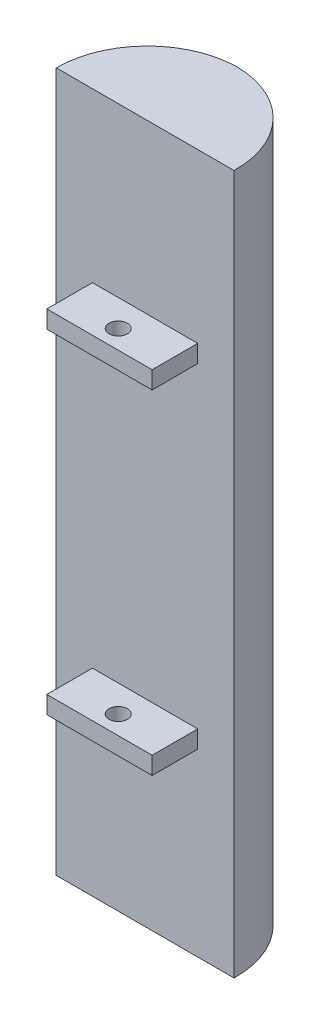
ISO-10303-21;
HEADER;
FILE_DESCRIPTION(('STEP AP214'),'2;1');
FILE_NAME('part.step','',(''),(''),'','','');
FILE_SCHEMA(('AUTOMOTIVE_DESIGN { 1 0 10303 214 1 1 1 1 }'));
ENDSEC;
DATA;
#1=APPLICATION_CONTEXT('core data for automotive mechanical design processes');
#2=APPLICATION_PROTOCOL_DEFINITION('international standard','automotive_design',2000,#1);
#3=PRODUCT_CONTEXT('',#1,'mechanical');
#4=PRODUCT('Part','Part','',(#3));
#5=PRODUCT_RELATED_PRODUCT_CATEGORY('part','',(#4));
#6=PRODUCT_DEFINITION_FORMATION('','',#4);
#7=PRODUCT_DEFINITION_CONTEXT('part definition',#1,'design');
#8=PRODUCT_DEFINITION('design','',#6,#7);
#9=PRODUCT_DEFINITION_SHAPE('','',#8);
#10=(LENGTH_UNIT() NAMED_UNIT(*) SI_UNIT(.MILLI.,.METRE.));
#11=(NAMED_UNIT(*) PLANE_ANGLE_UNIT() SI_UNIT($,.RADIAN.));
#12=(NAMED_UNIT(*) SI_UNIT($,.STERADIAN.) SOLID_ANGLE_UNIT());
#13=UNCERTAINTY_MEASURE_WITH_UNIT(LENGTH_MEASURE(1.E-05),#10,'distance_accuracy_value','');
#14=(GEOMETRIC_REPRESENTATION_CONTEXT(3) GLOBAL_UNCERTAINTY_ASSIGNED_CONTEXT((#13)) GLOBAL_UNIT_ASSIGNED_CONTEXT((#10,
#11,#12)) REPRESENTATION_CONTEXT('',''));
#15=CARTESIAN_POINT('',(0.,0.,0.));
#16=DIRECTION('',(0.,0.,1.));
#17=DIRECTION('',(1.,0.,0.));
#18=AXIS2_PLACEMENT_3D('',#15,#16,#17);
#19=CARTESIAN_POINT('',(-76.,598.,0.));
#20=DIRECTION('',(0.,0.,-1.));
#21=DIRECTION('',(-1.,0.,0.));
#22=AXIS2_PLACEMENT_3D('',#19,#20,#21);
#23=PLANE('',#22);
#24=DIRECTION('',(0.,1.,0.));
#25=VECTOR('',#24,1.);
#26=CARTESIAN_POINT('',(45.,439.440168310259,0.));
#27=LINE('',#26,#25);
#28=CARTESIAN_POINT('',(45.,439.440168310259,0.));
#29=VERTEX_POINT('',#28);
#30=CARTESIAN_POINT('',(45.,454.440168310259,0.));
#31=VERTEX_POINT('',#30);
#32=EDGE_CURVE('E138',#29,#31,#27,.T.);
#33=ORIENTED_EDGE('',*,*,#32,.F.);
#34=DIRECTION('',(1.,0.,0.));
#35=VECTOR('',#34,1.);
#36=CARTESIAN_POINT('',(-45.,439.440168310259,0.));
#37=LINE('',#36,#35);
#38=CARTESIAN_POINT('',(-45.,439.440168310259,0.));
#39=VERTEX_POINT('',#38);
#40=EDGE_CURVE('E151',#39,#29,#37,.T.);
#41=ORIENTED_EDGE('',*,*,#40,.F.);
#42=DIRECTION('',(0.,-1.,0.));
#43=VECTOR('',#42,1.);
#44=CARTESIAN_POINT('',(-45.,439.440168310259,0.));
#45=LINE('',#44,#43);
#46=CARTESIAN_POINT('',(-45.,454.440168310258,0.));
#47=VERTEX_POINT('',#46);
#48=EDGE_CURVE('E160',#47,#39,#45,.T.);
#49=ORIENTED_EDGE('',*,*,#48,.F.);
#50=DIRECTION('',(-1.,0.,0.));
#51=VECTOR('',#50,1.);
#52=CARTESIAN_POINT('',(-45.,454.440168310259,0.));
#53=LINE('',#52,#51);
#54=EDGE_CURVE('E141',#31,#47,#53,.T.);
#55=ORIENTED_EDGE('',*,*,#54,.F.);
#56=EDGE_LOOP('',(#33,#41,#49,#55));
#57=FACE_BOUND('',#56,.T.);
#58=DIRECTION('',(1.,0.,0.));
#59=VECTOR('',#58,1.);
#60=CARTESIAN_POINT('',(-76.,0.,0.));
#61=LINE('',#60,#59);
#62=CARTESIAN_POINT('',(-76.,0.,0.));
#63=VERTEX_POINT('',#62);
#64=CARTESIAN_POINT('',(76.,0.,0.));
#65=VERTEX_POINT('',#64);
#66=EDGE_CURVE('E181',#63,#65,#61,.T.);
#67=ORIENTED_EDGE('',*,*,#66,.T.);
#68=DIRECTION('',(0.,-1.,0.));
#69=VECTOR('',#68,1.);
#70=CARTESIAN_POINT('',(76.,598.,0.));
#71=LINE('',#70,#69);
#72=CARTESIAN_POINT('',(76.,598.,0.));
#73=VERTEX_POINT('',#72);
#74=EDGE_CURVE('E185',#73,#65,#71,.T.);
#75=ORIENTED_EDGE('',*,*,#74,.F.);
#76=DIRECTION('',(1.,0.,0.));
#77=VECTOR('',#76,1.);
#78=CARTESIAN_POINT('',(-76.,598.,0.));
#79=LINE('',#78,#77);
#80=CARTESIAN_POINT('',(-76.,598.,0.));
#81=VERTEX_POINT('',#80);
#82=EDGE_CURVE('E183',#81,#73,#79,.T.);
#83=ORIENTED_EDGE('',*,*,#82,.F.);
#84=DIRECTION('',(0.,-1.,0.));
#85=VECTOR('',#84,1.);
#86=CARTESIAN_POINT('',(-76.,598.,0.));
#87=LINE('',#86,#85);
#88=EDGE_CURVE('E42',#81,#63,#87,.T.);
#89=ORIENTED_EDGE('',*,*,#88,.T.);
#90=EDGE_LOOP('',(#67,#75,#83,#89));
#91=FACE_BOUND('',#90,.T.);
#92=DIRECTION('',(0.,1.,0.));
#93=VECTOR('',#92,1.);
#94=CARTESIAN_POINT('',(45.,153.960515061216,0.));
#95=LINE('',#94,#93);
#96=CARTESIAN_POINT('',(45.,153.960515061216,0.));
#97=VERTEX_POINT('',#96);
#98=CARTESIAN_POINT('',(45.,168.960515061217,0.));
#99=VERTEX_POINT('',#98);
#100=EDGE_CURVE('E137',#97,#99,#95,.T.);
#101=ORIENTED_EDGE('',*,*,#100,.F.);
#102=DIRECTION('',(1.,0.,0.));
#103=VECTOR('',#102,1.);
#104=CARTESIAN_POINT('',(-45.,153.960515061216,0.));
#105=LINE('',#104,#103);
#106=CARTESIAN_POINT('',(-45.,153.960515061216,0.));
#107=VERTEX_POINT('',#106);
#108=EDGE_CURVE('E134',#107,#97,#105,.T.);
#109=ORIENTED_EDGE('',*,*,#108,.F.);
#110=DIRECTION('',(0.,-1.,0.));
#111=VECTOR('',#110,1.);
#112=CARTESIAN_POINT('',(-45.,153.960515061216,0.));
#113=LINE('',#112,#111);
#114=CARTESIAN_POINT('',(-45.,168.960515061217,0.));
#115=VERTEX_POINT('',#114);
#116=EDGE_CURVE('E54',#115,#107,#113,.T.);
#117=ORIENTED_EDGE('',*,*,#116,.F.);
#118=DIRECTION('',(-1.,0.,0.));
#119=VECTOR('',#118,1.);
#120=CARTESIAN_POINT('',(-45.,168.960515061217,0.));
#121=LINE('',#120,#119);
#122=EDGE_CURVE('E49',#99,#115,#121,.T.);
#123=ORIENTED_EDGE('',*,*,#122,.F.);
#124=EDGE_LOOP('',(#101,#109,#117,#123));
#125=FACE_BOUND('',#124,.T.);
#126=ADVANCED_FACE('F33',(#57,#91,#125),#23,.F.);
#127=CARTESIAN_POINT('',(0.,598.,-1.97435897435896));
#128=DIRECTION('',(0.,-1.,0.));
#129=DIRECTION('',(0.,0.,-1.));
#130=AXIS2_PLACEMENT_3D('',#127,#128,#129);
#131=CYLINDRICAL_SURFACE('',#130,76.025641025641);
#132=CARTESIAN_POINT('',(0.,0.,-1.97435897435896));
#133=DIRECTION('',(0.,1.,0.));
#134=DIRECTION('',(0.,0.,-1.));
#135=AXIS2_PLACEMENT_3D('',#132,#133,#134);
#136=CIRCLE('',#135,76.025641025641);
#137=CARTESIAN_POINT('',(0.,0.,-78.));
#138=VERTEX_POINT('',#137);
#139=EDGE_CURVE('E176',#65,#138,#136,.T.);
#140=ORIENTED_EDGE('',*,*,#139,.T.);
#141=DIRECTION('',(0.,-1.,0.));
#142=VECTOR('',#141,1.);
#143=CARTESIAN_POINT('',(0.,598.,-78.));
#144=LINE('',#143,#142);
#145=CARTESIAN_POINT('',(0.,598.,-78.));
#146=VERTEX_POINT('',#145);
#147=EDGE_CURVE('E11',#146,#138,#144,.T.);
#148=ORIENTED_EDGE('',*,*,#147,.F.);
#149=CARTESIAN_POINT('',(0.,598.,-1.97435897435896));
#150=DIRECTION('',(0.,1.,0.));
#151=DIRECTION('',(0.,0.,-1.));
#152=AXIS2_PLACEMENT_3D('',#149,#150,#151);
#153=CIRCLE('',#152,76.025641025641);
#154=EDGE_CURVE('E177',#73,#146,#153,.T.);
#155=ORIENTED_EDGE('',*,*,#154,.F.);
#156=ORIENTED_EDGE('',*,*,#74,.T.);
#157=EDGE_LOOP('',(#140,#148,#155,#156));
#158=FACE_BOUND('',#157,.T.);
#159=ADVANCED_FACE('F35',(#158),#131,.T.);
#160=CARTESIAN_POINT('',(2.02631578947371,598.,0.));
#161=DIRECTION('',(0.,-1.,0.));
#162=DIRECTION('',(0.,0.,-1.));
#163=AXIS2_PLACEMENT_3D('',#160,#161,#162);
#164=CYLINDRICAL_SURFACE('',#163,78.0263157894737);
#165=CARTESIAN_POINT('',(2.02631578947371,0.,0.));
#166=DIRECTION('',(0.,1.,0.));
#167=DIRECTION('',(0.,0.,-1.));
#168=AXIS2_PLACEMENT_3D('',#165,#166,#167);
#169=CIRCLE('',#168,78.0263157894737);
#170=EDGE_CURVE('E188',#138,#63,#169,.T.);
#171=ORIENTED_EDGE('',*,*,#170,.T.);
#172=ORIENTED_EDGE('',*,*,#88,.F.);
#173=CARTESIAN_POINT('',(2.02631578947371,598.,0.));
#174=DIRECTION('',(0.,1.,0.));
#175=DIRECTION('',(0.,0.,-1.));
#176=AXIS2_PLACEMENT_3D('',#173,#174,#175);
#177=CIRCLE('',#176,78.0263157894737);
#178=EDGE_CURVE('E180',#146,#81,#177,.T.);
#179=ORIENTED_EDGE('',*,*,#178,.F.);
#180=ORIENTED_EDGE('',*,*,#147,.T.);
#181=EDGE_LOOP('',(#171,#172,#179,#180));
#182=FACE_BOUND('',#181,.T.);
#183=ADVANCED_FACE('F208',(#182),#164,.T.);
#184=CARTESIAN_POINT('',(0.,598.,-1.97435897435896));
#185=DIRECTION('',(0.,-1.,0.));
#186=DIRECTION('',(0.,0.,-1.));
#187=AXIS2_PLACEMENT_3D('',#184,#185,#186);
#188=PLANE('',#187);
#189=ORIENTED_EDGE('',*,*,#154,.T.);
#190=ORIENTED_EDGE('',*,*,#178,.T.);
#191=ORIENTED_EDGE('',*,*,#82,.T.);
#192=EDGE_LOOP('',(#189,#190,#191));
#193=FACE_BOUND('',#192,.T.);
#194=ADVANCED_FACE('F207',(#193),#188,.F.);
#195=CARTESIAN_POINT('',(0.,0.,-1.97435897435896));
#196=DIRECTION('',(0.,-1.,0.));
#197=DIRECTION('',(0.,0.,-1.));
#198=AXIS2_PLACEMENT_3D('',#195,#196,#197);
#199=PLANE('',#198);
#200=ORIENTED_EDGE('',*,*,#139,.F.);
#201=ORIENTED_EDGE('',*,*,#66,.F.);
#202=ORIENTED_EDGE('',*,*,#170,.F.);
#203=EDGE_LOOP('',(#200,#201,#202));
#204=FACE_BOUND('',#203,.T.);
#205=ADVANCED_FACE('F202',(#204),#199,.T.);
#206=CARTESIAN_POINT('',(45.,439.440168310259,39.));
#207=DIRECTION('',(-1.,0.,0.));
#208=DIRECTION('',(0.,0.,1.));
#209=AXIS2_PLACEMENT_3D('',#206,#207,#208);
#210=PLANE('',#209);
#211=ORIENTED_EDGE('',*,*,#32,.T.);
#212=DIRECTION('',(0.,0.,-1.));
#213=VECTOR('',#212,1.);
#214=CARTESIAN_POINT('',(45.,454.440168310259,39.));
#215=LINE('',#214,#213);
#216=CARTESIAN_POINT('',(45.,454.440168310259,39.));
#217=VERTEX_POINT('',#216);
#218=EDGE_CURVE('E173',#217,#31,#215,.T.);
#219=ORIENTED_EDGE('',*,*,#218,.F.);
#220=DIRECTION('',(0.,1.,0.));
#221=VECTOR('',#220,1.);
#222=CARTESIAN_POINT('',(45.,439.440168310259,39.));
#223=LINE('',#222,#221);
#224=CARTESIAN_POINT('',(45.,439.440168310259,39.));
#225=VERTEX_POINT('',#224);
#226=EDGE_CURVE('E147',#225,#217,#223,.T.);
#227=ORIENTED_EDGE('',*,*,#226,.F.);
#228=DIRECTION('',(0.,0.,-1.));
#229=VECTOR('',#228,1.);
#230=CARTESIAN_POINT('',(45.,439.440168310259,39.));
#231=LINE('',#230,#229);
#232=EDGE_CURVE('E156',#225,#29,#231,.T.);
#233=ORIENTED_EDGE('',*,*,#232,.T.);
#234=EDGE_LOOP('',(#211,#219,#227,#233));
#235=FACE_BOUND('',#234,.T.);
#236=ADVANCED_FACE('F224',(#235),#210,.F.);
#237=CARTESIAN_POINT('',(-45.,454.440168310259,39.));
#238=DIRECTION('',(0.,-1.,0.));
#239=DIRECTION('',(0.,0.,-1.));
#240=AXIS2_PLACEMENT_3D('',#237,#238,#239);
#241=PLANE('',#240);
#242=CARTESIAN_POINT('',(0.,454.440168310259,22.9839423769189));
#243=DIRECTION('',(0.,-1.,0.));
#244=DIRECTION('',(0.,0.,-1.));
#245=AXIS2_PLACEMENT_3D('',#242,#243,#244);
#246=CIRCLE('',#245,7.875);
#247=CARTESIAN_POINT('',(0.,454.440168310259,15.108942376919));
#248=VERTEX_POINT('',#247);
#249=EDGE_CURVE('E274',#248,#248,#246,.T.);
#250=ORIENTED_EDGE('',*,*,#249,.T.);
#251=EDGE_LOOP('',(#250));
#252=FACE_BOUND('',#251,.T.);
#253=ORIENTED_EDGE('',*,*,#54,.T.);
#254=DIRECTION('',(0.,0.,-1.));
#255=VECTOR('',#254,1.);
#256=CARTESIAN_POINT('',(-45.,454.440168310259,39.));
#257=LINE('',#256,#255);
#258=CARTESIAN_POINT('',(-45.,454.440168310259,39.));
#259=VERTEX_POINT('',#258);
#260=EDGE_CURVE('E170',#259,#47,#257,.T.);
#261=ORIENTED_EDGE('',*,*,#260,.F.);
#262=DIRECTION('',(-1.,0.,0.));
#263=VECTOR('',#262,1.);
#264=CARTESIAN_POINT('',(-45.,454.440168310259,39.));
#265=LINE('',#264,#263);
#266=EDGE_CURVE('E150',#217,#259,#265,.T.);
#267=ORIENTED_EDGE('',*,*,#266,.F.);
#268=ORIENTED_EDGE('',*,*,#218,.T.);
#269=EDGE_LOOP('',(#253,#261,#267,#268));
#270=FACE_BOUND('',#269,.T.);
#271=ADVANCED_FACE('F228',(#252,#270),#241,.F.);
#272=CARTESIAN_POINT('',(-45.,439.440168310259,39.));
#273=DIRECTION('',(1.,0.,0.));
#274=DIRECTION('',(0.,0.,-1.));
#275=AXIS2_PLACEMENT_3D('',#272,#273,#274);
#276=PLANE('',#275);
#277=ORIENTED_EDGE('',*,*,#48,.T.);
#278=DIRECTION('',(0.,0.,-1.));
#279=VECTOR('',#278,1.);
#280=CARTESIAN_POINT('',(-45.,439.440168310259,39.));
#281=LINE('',#280,#279);
#282=CARTESIAN_POINT('',(-45.,439.440168310259,39.));
#283=VERTEX_POINT('',#282);
#284=EDGE_CURVE('E167',#283,#39,#281,.T.);
#285=ORIENTED_EDGE('',*,*,#284,.F.);
#286=DIRECTION('',(0.,-1.,0.));
#287=VECTOR('',#286,1.);
#288=CARTESIAN_POINT('',(-45.,439.440168310259,39.));
#289=LINE('',#288,#287);
#290=EDGE_CURVE('E153',#259,#283,#289,.T.);
#291=ORIENTED_EDGE('',*,*,#290,.F.);
#292=ORIENTED_EDGE('',*,*,#260,.T.);
#293=EDGE_LOOP('',(#277,#285,#291,#292));
#294=FACE_BOUND('',#293,.T.);
#295=ADVANCED_FACE('F232',(#294),#276,.F.);
#296=CARTESIAN_POINT('',(-45.,439.440168310259,39.));
#297=DIRECTION('',(0.,1.,0.));
#298=DIRECTION('',(0.,0.,1.));
#299=AXIS2_PLACEMENT_3D('',#296,#297,#298);
#300=PLANE('',#299);
#301=CARTESIAN_POINT('',(0.,439.440168310259,22.9839423769189));
#302=DIRECTION('',(0.,1.,0.));
#303=DIRECTION('',(0.,0.,1.));
#304=AXIS2_PLACEMENT_3D('',#301,#302,#303);
#305=CIRCLE('',#304,7.875);
#306=CARTESIAN_POINT('',(0.,439.440168310258,15.108942376919));
#307=VERTEX_POINT('',#306);
#308=EDGE_CURVE('E271',#307,#307,#305,.T.);
#309=ORIENTED_EDGE('',*,*,#308,.T.);
#310=EDGE_LOOP('',(#309));
#311=FACE_BOUND('',#310,.T.);
#312=ORIENTED_EDGE('',*,*,#40,.T.);
#313=ORIENTED_EDGE('',*,*,#232,.F.);
#314=DIRECTION('',(1.,0.,0.));
#315=VECTOR('',#314,1.);
#316=CARTESIAN_POINT('',(-45.,439.440168310259,39.));
#317=LINE('',#316,#315);
#318=EDGE_CURVE('E155',#283,#225,#317,.T.);
#319=ORIENTED_EDGE('',*,*,#318,.F.);
#320=ORIENTED_EDGE('',*,*,#284,.T.);
#321=EDGE_LOOP('',(#312,#313,#319,#320));
#322=FACE_BOUND('',#321,.T.);
#323=ADVANCED_FACE('F236',(#311,#322),#300,.F.);
#324=CARTESIAN_POINT('',(0.,0.,39.));
#325=DIRECTION('',(0.,0.,-1.));
#326=DIRECTION('',(-1.,0.,0.));
#327=AXIS2_PLACEMENT_3D('',#324,#325,#326);
#328=PLANE('',#327);
#329=ORIENTED_EDGE('',*,*,#226,.T.);
#330=ORIENTED_EDGE('',*,*,#266,.T.);
#331=ORIENTED_EDGE('',*,*,#290,.T.);
#332=ORIENTED_EDGE('',*,*,#318,.T.);
#333=EDGE_LOOP('',(#329,#330,#331,#332));
#334=FACE_BOUND('',#333,.T.);
#335=ADVANCED_FACE('F240',(#334),#328,.F.);
#336=CARTESIAN_POINT('',(45.,153.960515061216,39.));
#337=DIRECTION('',(-1.,0.,0.));
#338=DIRECTION('',(0.,0.,1.));
#339=AXIS2_PLACEMENT_3D('',#336,#337,#338);
#340=PLANE('',#339);
#341=ORIENTED_EDGE('',*,*,#100,.T.);
#342=DIRECTION('',(0.,0.,-1.));
#343=VECTOR('',#342,1.);
#344=CARTESIAN_POINT('',(45.,168.960515061217,39.));
#345=LINE('',#344,#343);
#346=CARTESIAN_POINT('',(45.,168.960515061217,39.));
#347=VERTEX_POINT('',#346);
#348=EDGE_CURVE('E118',#347,#99,#345,.T.);
#349=ORIENTED_EDGE('',*,*,#348,.F.);
#350=DIRECTION('',(0.,1.,0.));
#351=VECTOR('',#350,1.);
#352=CARTESIAN_POINT('',(45.,153.960515061216,39.));
#353=LINE('',#352,#351);
#354=CARTESIAN_POINT('',(45.,153.960515061216,39.));
#355=VERTEX_POINT('',#354);
#356=EDGE_CURVE('E125',#355,#347,#353,.T.);
#357=ORIENTED_EDGE('',*,*,#356,.F.);
#358=DIRECTION('',(0.,0.,-1.));
#359=VECTOR('',#358,1.);
#360=CARTESIAN_POINT('',(45.,153.960515061216,39.));
#361=LINE('',#360,#359);
#362=EDGE_CURVE('E282',#355,#97,#361,.T.);
#363=ORIENTED_EDGE('',*,*,#362,.T.);
#364=EDGE_LOOP('',(#341,#349,#357,#363));
#365=FACE_BOUND('',#364,.T.);
#366=ADVANCED_FACE('F136',(#365),#340,.F.);
#367=CARTESIAN_POINT('',(-45.,168.960515061217,39.));
#368=DIRECTION('',(0.,-1.,0.));
#369=DIRECTION('',(0.,0.,-1.));
#370=AXIS2_PLACEMENT_3D('',#367,#368,#369);
#371=PLANE('',#370);
#372=CARTESIAN_POINT('',(0.,168.960515061217,22.9839423769189));
#373=DIRECTION('',(0.,-1.,0.));
#374=DIRECTION('',(0.,0.,-1.));
#375=AXIS2_PLACEMENT_3D('',#372,#373,#374);
#376=CIRCLE('',#375,7.875);
#377=CARTESIAN_POINT('',(0.,168.960515061217,15.108942376919));
#378=VERTEX_POINT('',#377);
#379=EDGE_CURVE('E277',#378,#378,#376,.T.);
#380=ORIENTED_EDGE('',*,*,#379,.T.);
#381=EDGE_LOOP('',(#380));
#382=FACE_BOUND('',#381,.T.);
#383=ORIENTED_EDGE('',*,*,#122,.T.);
#384=DIRECTION('',(0.,0.,-1.));
#385=VECTOR('',#384,1.);
#386=CARTESIAN_POINT('',(-45.,168.960515061217,39.));
#387=LINE('',#386,#385);
#388=CARTESIAN_POINT('',(-45.,168.960515061217,39.));
#389=VERTEX_POINT('',#388);
#390=EDGE_CURVE('E121',#389,#115,#387,.T.);
#391=ORIENTED_EDGE('',*,*,#390,.F.);
#392=DIRECTION('',(-1.,0.,0.));
#393=VECTOR('',#392,1.);
#394=CARTESIAN_POINT('',(-45.,168.960515061217,39.));
#395=LINE('',#394,#393);
#396=EDGE_CURVE('E114',#347,#389,#395,.T.);
#397=ORIENTED_EDGE('',*,*,#396,.F.);
#398=ORIENTED_EDGE('',*,*,#348,.T.);
#399=EDGE_LOOP('',(#383,#391,#397,#398));
#400=FACE_BOUND('',#399,.T.);
#401=ADVANCED_FACE('F116',(#382,#400),#371,.F.);
#402=CARTESIAN_POINT('',(-45.,153.960515061216,39.));
#403=DIRECTION('',(1.,0.,0.));
#404=DIRECTION('',(0.,0.,-1.));
#405=AXIS2_PLACEMENT_3D('',#402,#403,#404);
#406=PLANE('',#405);
#407=ORIENTED_EDGE('',*,*,#116,.T.);
#408=DIRECTION('',(0.,0.,-1.));
#409=VECTOR('',#408,1.);
#410=CARTESIAN_POINT('',(-45.,153.960515061216,39.));
#411=LINE('',#410,#409);
#412=CARTESIAN_POINT('',(-45.,153.960515061216,39.));
#413=VERTEX_POINT('',#412);
#414=EDGE_CURVE('E143',#413,#107,#411,.T.);
#415=ORIENTED_EDGE('',*,*,#414,.F.);
#416=DIRECTION('',(0.,-1.,0.));
#417=VECTOR('',#416,1.);
#418=CARTESIAN_POINT('',(-45.,153.960515061216,39.));
#419=LINE('',#418,#417);
#420=EDGE_CURVE('E124',#389,#413,#419,.T.);
#421=ORIENTED_EDGE('',*,*,#420,.F.);
#422=ORIENTED_EDGE('',*,*,#390,.T.);
#423=EDGE_LOOP('',(#407,#415,#421,#422));
#424=FACE_BOUND('',#423,.T.);
#425=ADVANCED_FACE('F249',(#424),#406,.F.);
#426=CARTESIAN_POINT('',(-45.,153.960515061216,39.));
#427=DIRECTION('',(0.,1.,0.));
#428=DIRECTION('',(0.,0.,1.));
#429=AXIS2_PLACEMENT_3D('',#426,#427,#428);
#430=PLANE('',#429);
#431=CARTESIAN_POINT('',(0.,153.960515061216,22.9839423769189));
#432=DIRECTION('',(0.,1.,0.));
#433=DIRECTION('',(0.,0.,1.));
#434=AXIS2_PLACEMENT_3D('',#431,#432,#433);
#435=CIRCLE('',#434,7.875);
#436=CARTESIAN_POINT('',(0.,153.960515061216,15.108942376919));
#437=VERTEX_POINT('',#436);
#438=EDGE_CURVE('E37',#437,#437,#435,.T.);
#439=ORIENTED_EDGE('',*,*,#438,.T.);
#440=EDGE_LOOP('',(#439));
#441=FACE_BOUND('',#440,.T.);
#442=ORIENTED_EDGE('',*,*,#108,.T.);
#443=ORIENTED_EDGE('',*,*,#362,.F.);
#444=DIRECTION('',(1.,0.,0.));
#445=VECTOR('',#444,1.);
#446=CARTESIAN_POINT('',(-45.,153.960515061216,39.));
#447=LINE('',#446,#445);
#448=EDGE_CURVE('E130',#413,#355,#447,.T.);
#449=ORIENTED_EDGE('',*,*,#448,.F.);
#450=ORIENTED_EDGE('',*,*,#414,.T.);
#451=EDGE_LOOP('',(#442,#443,#449,#450));
#452=FACE_BOUND('',#451,.T.);
#453=ADVANCED_FACE('F253',(#441,#452),#430,.F.);
#454=CARTESIAN_POINT('',(0.,0.,39.));
#455=DIRECTION('',(0.,0.,-1.));
#456=DIRECTION('',(-1.,0.,0.));
#457=AXIS2_PLACEMENT_3D('',#454,#455,#456);
#458=PLANE('',#457);
#459=ORIENTED_EDGE('',*,*,#356,.T.);
#460=ORIENTED_EDGE('',*,*,#396,.T.);
#461=ORIENTED_EDGE('',*,*,#420,.T.);
#462=ORIENTED_EDGE('',*,*,#448,.T.);
#463=EDGE_LOOP('',(#459,#460,#461,#462));
#464=FACE_BOUND('',#463,.T.);
#465=ADVANCED_FACE('F128',(#464),#458,.F.);
#466=CARTESIAN_POINT('',(0.,598.,22.9839423769189));
#467=DIRECTION('',(0.,-1.,0.));
#468=DIRECTION('',(0.,0.,-1.));
#469=AXIS2_PLACEMENT_3D('',#466,#467,#468);
#470=CYLINDRICAL_SURFACE('',#469,7.875);
#471=CARTESIAN_POINT('',(0.,153.960515061216,15.108942376919));
#472=CARTESIAN_POINT('',(0.,154.116765061216,15.108942376919));
#473=CARTESIAN_POINT('',(0.,154.273015061217,15.108942376919));
#474=CARTESIAN_POINT('',(0.,154.585515061217,15.108942376919));
#475=CARTESIAN_POINT('',(0.,154.741765061216,15.108942376919));
#476=CARTESIAN_POINT('',(0.,155.054265061216,15.108942376919));
#477=CARTESIAN_POINT('',(0.,155.210515061216,15.108942376919));
#478=CARTESIAN_POINT('',(0.,155.523015061216,15.108942376919));
#479=CARTESIAN_POINT('',(0.,155.679265061217,15.108942376919));
#480=CARTESIAN_POINT('',(0.,155.991765061217,15.108942376919));
#481=CARTESIAN_POINT('',(0.,156.148015061216,15.108942376919));
#482=CARTESIAN_POINT('',(0.,156.460515061216,15.108942376919));
#483=CARTESIAN_POINT('',(0.,156.616765061216,15.108942376919));
#484=CARTESIAN_POINT('',(0.,156.929265061216,15.108942376919));
#485=CARTESIAN_POINT('',(0.,157.085515061217,15.108942376919));
#486=CARTESIAN_POINT('',(0.,157.398015061217,15.108942376919));
#487=CARTESIAN_POINT('',(0.,157.554265061217,15.108942376919));
#488=CARTESIAN_POINT('',(0.,157.866765061217,15.108942376919));
#489=CARTESIAN_POINT('',(0.,158.023015061216,15.108942376919));
#490=CARTESIAN_POINT('',(0.,158.335515061216,15.108942376919));
#491=CARTESIAN_POINT('',(0.,158.491765061217,15.108942376919));
#492=CARTESIAN_POINT('',(0.,158.804265061217,15.108942376919));
#493=CARTESIAN_POINT('',(0.,158.960515061217,15.108942376919));
#494=CARTESIAN_POINT('',(0.,159.273015061217,15.108942376919));
#495=CARTESIAN_POINT('',(0.,159.429265061216,15.108942376919));
#496=CARTESIAN_POINT('',(0.,159.741765061216,15.108942376919));
#497=CARTESIAN_POINT('',(0.,159.898015061217,15.108942376919));
#498=CARTESIAN_POINT('',(0.,160.210515061217,15.108942376919));
#499=CARTESIAN_POINT('',(0.,160.366765061217,15.108942376919));
#500=CARTESIAN_POINT('',(0.,160.679265061217,15.108942376919));
#501=CARTESIAN_POINT('',(0.,160.835515061216,15.108942376919));
#502=CARTESIAN_POINT('',(0.,161.148015061216,15.108942376919));
#503=CARTESIAN_POINT('',(0.,161.304265061217,15.108942376919));
#504=CARTESIAN_POINT('',(0.,161.616765061217,15.108942376919));
#505=CARTESIAN_POINT('',(0.,161.773015061217,15.108942376919));
#506=CARTESIAN_POINT('',(0.,162.085515061217,15.108942376919));
#507=CARTESIAN_POINT('',(0.,162.241765061216,15.108942376919));
#508=CARTESIAN_POINT('',(0.,162.554265061216,15.108942376919));
#509=CARTESIAN_POINT('',(0.,162.710515061217,15.108942376919));
#510=CARTESIAN_POINT('',(0.,163.023015061216,15.108942376919));
#511=CARTESIAN_POINT('',(0.,163.179265061217,15.108942376919));
#512=CARTESIAN_POINT('',(0.,163.491765061217,15.108942376919));
#513=CARTESIAN_POINT('',(0.,163.648015061216,15.108942376919));
#514=CARTESIAN_POINT('',(0.,163.960515061216,15.108942376919));
#515=CARTESIAN_POINT('',(0.,164.116765061217,15.108942376919));
#516=CARTESIAN_POINT('',(0.,164.429265061216,15.108942376919));
#517=CARTESIAN_POINT('',(0.,164.585515061217,15.108942376919));
#518=CARTESIAN_POINT('',(0.,164.898015061217,15.108942376919));
#519=CARTESIAN_POINT('',(0.,165.054265061216,15.108942376919));
#520=CARTESIAN_POINT('',(0.,165.366765061216,15.108942376919));
#521=CARTESIAN_POINT('',(0.,165.523015061217,15.108942376919));
#522=CARTESIAN_POINT('',(0.,165.835515061216,15.108942376919));
#523=CARTESIAN_POINT('',(0.,165.991765061217,15.108942376919));
#524=CARTESIAN_POINT('',(0.,166.304265061217,15.108942376919));
#525=CARTESIAN_POINT('',(0.,166.460515061217,15.108942376919));
#526=CARTESIAN_POINT('',(0.,166.773015061217,15.108942376919));
#527=CARTESIAN_POINT('',(0.,166.929265061216,15.108942376919));
#528=CARTESIAN_POINT('',(0.,167.241765061216,15.108942376919));
#529=CARTESIAN_POINT('',(0.,167.398015061217,15.108942376919));
#530=CARTESIAN_POINT('',(0.,167.710515061217,15.108942376919));
#531=CARTESIAN_POINT('',(0.,167.866765061217,15.108942376919));
#532=CARTESIAN_POINT('',(0.,168.179265061217,15.108942376919));
#533=CARTESIAN_POINT('',(0.,168.335515061216,15.108942376919));
#534=CARTESIAN_POINT('',(0.,168.648015061216,15.108942376919));
#535=CARTESIAN_POINT('',(0.,168.804265061217,15.108942376919));
#536=CARTESIAN_POINT('',(0.,168.960515061217,15.108942376919));
#537=B_SPLINE_CURVE_WITH_KNOTS('',3,(#471,#472,#473,#474,#475,#476,#477,#478,#479,#480,#481,
#482,#483,#484,#485,#486,#487,#488,#489,#490,#491,#492,#493,#494,#495,#496,#497,#498,#499,#500,
#501,#502,#503,#504,#505,#506,#507,#508,#509,#510,#511,#512,#513,#514,#515,#516,#517,#518,#519,
#520,#521,#522,#523,#524,#525,#526,#527,#528,#529,#530,#531,#532,#533,#534,#535,#536),
.UNSPECIFIED.,.F.,.F.,(4,2,2,2,2,2,2,2,2,2,2,2,2,2,2,2,2,2,2,2,2,2,2,2,2,2,2,2,2,2,2,2,4),(0.,
0.468750000000018,0.93749999999998,1.40625,1.87500000000002,2.34374999999998,2.8125,
3.28125000000001,3.75000000000003,4.21874999999999,4.68750000000001,5.15625000000003,
5.62499999999999,6.09375000000001,6.56250000000003,7.03124999999999,7.50000000000001,
7.96875000000002,8.43749999999999,8.90625,9.37500000000002,9.84374999999998,10.3125,10.78125,
11.25,11.71875,12.1875,12.65625,13.125,13.59375,14.0625,14.53125,15.),.UNSPECIFIED.);
#538=EDGE_CURVE('BSEAM260',#437,#378,#537,.T.);
#539=ORIENTED_EDGE('',*,*,#438,.F.);
#540=ORIENTED_EDGE('',*,*,#379,.F.);
#541=ORIENTED_EDGE('',*,*,#538,.T.);
#542=ORIENTED_EDGE('',*,*,#538,.F.);
#543=EDGE_LOOP('',(#539,#541,#540,#542));
#544=FACE_BOUND('',#543,.T.);
#545=ADVANCED_FACE('F260',(#544),#470,.F.);
#546=CARTESIAN_POINT('',(0.,439.440168310258,15.108942376919));
#547=CARTESIAN_POINT('',(0.,439.596418310258,15.108942376919));
#548=CARTESIAN_POINT('',(0.,439.752668310258,15.108942376919));
#549=CARTESIAN_POINT('',(0.,440.065168310259,15.108942376919));
#550=CARTESIAN_POINT('',(0.,440.221418310258,15.108942376919));
#551=CARTESIAN_POINT('',(0.,440.533918310259,15.108942376919));
#552=CARTESIAN_POINT('',(0.,440.690168310258,15.108942376919));
#553=CARTESIAN_POINT('',(0.,441.002668310259,15.108942376919));
#554=CARTESIAN_POINT('',(0.,441.158918310259,15.108942376919));
#555=CARTESIAN_POINT('',(0.,441.471418310259,15.108942376919));
#556=CARTESIAN_POINT('',(0.,441.627668310259,15.108942376919));
#557=CARTESIAN_POINT('',(0.,441.940168310259,15.108942376919));
#558=CARTESIAN_POINT('',(0.,442.096418310258,15.108942376919));
#559=CARTESIAN_POINT('',(0.,442.408918310258,15.108942376919));
#560=CARTESIAN_POINT('',(0.,442.565168310259,15.108942376919));
#561=CARTESIAN_POINT('',(0.,442.877668310259,15.108942376919));
#562=CARTESIAN_POINT('',(0.,443.033918310258,15.108942376919));
#563=CARTESIAN_POINT('',(0.,443.346418310259,15.108942376919));
#564=CARTESIAN_POINT('',(0.,443.502668310258,15.108942376919));
#565=CARTESIAN_POINT('',(0.,443.815168310259,15.108942376919));
#566=CARTESIAN_POINT('',(0.,443.971418310259,15.108942376919));
#567=CARTESIAN_POINT('',(0.,444.283918310259,15.108942376919));
#568=CARTESIAN_POINT('',(0.,444.440168310259,15.108942376919));
#569=CARTESIAN_POINT('',(0.,444.752668310259,15.108942376919));
#570=CARTESIAN_POINT('',(0.,444.908918310259,15.108942376919));
#571=CARTESIAN_POINT('',(0.,445.221418310259,15.108942376919));
#572=CARTESIAN_POINT('',(0.,445.377668310259,15.108942376919));
#573=CARTESIAN_POINT('',(0.,445.690168310258,15.108942376919));
#574=CARTESIAN_POINT('',(0.,445.846418310259,15.108942376919));
#575=CARTESIAN_POINT('',(0.,446.158918310259,15.108942376919));
#576=CARTESIAN_POINT('',(0.,446.315168310258,15.108942376919));
#577=CARTESIAN_POINT('',(0.,446.627668310259,15.108942376919));
#578=CARTESIAN_POINT('',(0.,446.783918310259,15.108942376919));
#579=CARTESIAN_POINT('',(0.,447.096418310259,15.108942376919));
#580=CARTESIAN_POINT('',(0.,447.252668310259,15.108942376919));
#581=CARTESIAN_POINT('',(0.,447.565168310259,15.108942376919));
#582=CARTESIAN_POINT('',(0.,447.721418310259,15.108942376919));
#583=CARTESIAN_POINT('',(0.,448.033918310259,15.108942376919));
#584=CARTESIAN_POINT('',(0.,448.190168310259,15.108942376919));
#585=CARTESIAN_POINT('',(0.,448.502668310259,15.108942376919));
#586=CARTESIAN_POINT('',(0.,448.658918310259,15.108942376919));
#587=CARTESIAN_POINT('',(0.,448.971418310259,15.108942376919));
#588=CARTESIAN_POINT('',(0.,449.127668310259,15.108942376919));
#589=CARTESIAN_POINT('',(0.,449.440168310259,15.108942376919));
#590=CARTESIAN_POINT('',(0.,449.596418310258,15.108942376919));
#591=CARTESIAN_POINT('',(0.,449.908918310259,15.108942376919));
#592=CARTESIAN_POINT('',(0.,450.065168310259,15.108942376919));
#593=CARTESIAN_POINT('',(0.,450.377668310259,15.108942376919));
#594=CARTESIAN_POINT('',(0.,450.533918310259,15.108942376919));
#595=CARTESIAN_POINT('',(0.,450.846418310259,15.108942376919));
#596=CARTESIAN_POINT('',(0.,451.002668310259,15.108942376919));
#597=CARTESIAN_POINT('',(0.,451.315168310259,15.108942376919));
#598=CARTESIAN_POINT('',(0.,451.471418310259,15.108942376919));
#599=CARTESIAN_POINT('',(0.,451.783918310259,15.108942376919));
#600=CARTESIAN_POINT('',(0.,451.940168310259,15.108942376919));
#601=CARTESIAN_POINT('',(0.,452.252668310259,15.108942376919));
#602=CARTESIAN_POINT('',(0.,452.408918310259,15.108942376919));
#603=CARTESIAN_POINT('',(0.,452.721418310259,15.108942376919));
#604=CARTESIAN_POINT('',(0.,452.877668310259,15.108942376919));
#605=CARTESIAN_POINT('',(0.,453.190168310259,15.108942376919));
#606=CARTESIAN_POINT('',(0.,453.346418310259,15.108942376919));
#607=CARTESIAN_POINT('',(0.,453.658918310259,15.108942376919));
#608=CARTESIAN_POINT('',(0.,453.815168310259,15.108942376919));
#609=CARTESIAN_POINT('',(0.,454.127668310259,15.108942376919));
#610=CARTESIAN_POINT('',(0.,454.283918310259,15.108942376919));
#611=CARTESIAN_POINT('',(0.,454.440168310259,15.108942376919));
#612=B_SPLINE_CURVE_WITH_KNOTS('',3,(#546,#547,#548,#549,#550,#551,#552,#553,#554,#555,#556,
#557,#558,#559,#560,#561,#562,#563,#564,#565,#566,#567,#568,#569,#570,#571,#572,#573,#574,#575,
#576,#577,#578,#579,#580,#581,#582,#583,#584,#585,#586,#587,#588,#589,#590,#591,#592,#593,#594,
#595,#596,#597,#598,#599,#600,#601,#602,#603,#604,#605,#606,#607,#608,#609,#610,#611),
.UNSPECIFIED.,.F.,.F.,(4,2,2,2,2,2,2,2,2,2,2,2,2,2,2,2,2,2,2,2,2,2,2,2,2,2,2,2,2,2,2,2,4),(0.,
0.468750000000018,0.937500000000036,1.40625000000005,1.87500000000007,2.34375000000003,
2.81250000000005,3.28125000000001,3.75000000000003,4.21875000000005,4.68750000000007,
5.15625000000008,5.62500000000005,6.09375000000006,6.56250000000003,7.03125000000004,
7.50000000000006,7.96875000000008,8.4375000000001,8.90625000000006,9.37500000000008,
9.84375000000004,10.3125000000001,10.7812500000001,11.2500000000001,11.7187500000001,
12.1875000000001,12.6562500000001,13.1250000000001,13.5937500000001,14.0625000000001,
14.5312500000001,15.0000000000001),.UNSPECIFIED.);
#613=EDGE_CURVE('BSEAM261',#307,#248,#612,.T.);
#614=ORIENTED_EDGE('',*,*,#308,.F.);
#615=ORIENTED_EDGE('',*,*,#249,.F.);
#616=ORIENTED_EDGE('',*,*,#613,.T.);
#617=ORIENTED_EDGE('',*,*,#613,.F.);
#618=EDGE_LOOP('',(#614,#616,#615,#617));
#619=FACE_BOUND('',#618,.T.);
#620=ADVANCED_FACE('F261',(#619),#470,.F.);
#621=CLOSED_SHELL('',(#126,#159,#183,#194,#205,#236,#271,#295,#323,#335,#366,#401,#425,#453,
#465,#545,#620));
#622=MANIFOLD_SOLID_BREP('B2',#621);
#623=ADVANCED_BREP_SHAPE_REPRESENTATION('',(#18,#622),#14);
#624=SHAPE_DEFINITION_REPRESENTATION(#9,#623);
ENDSEC;
END-ISO-10303-21;
